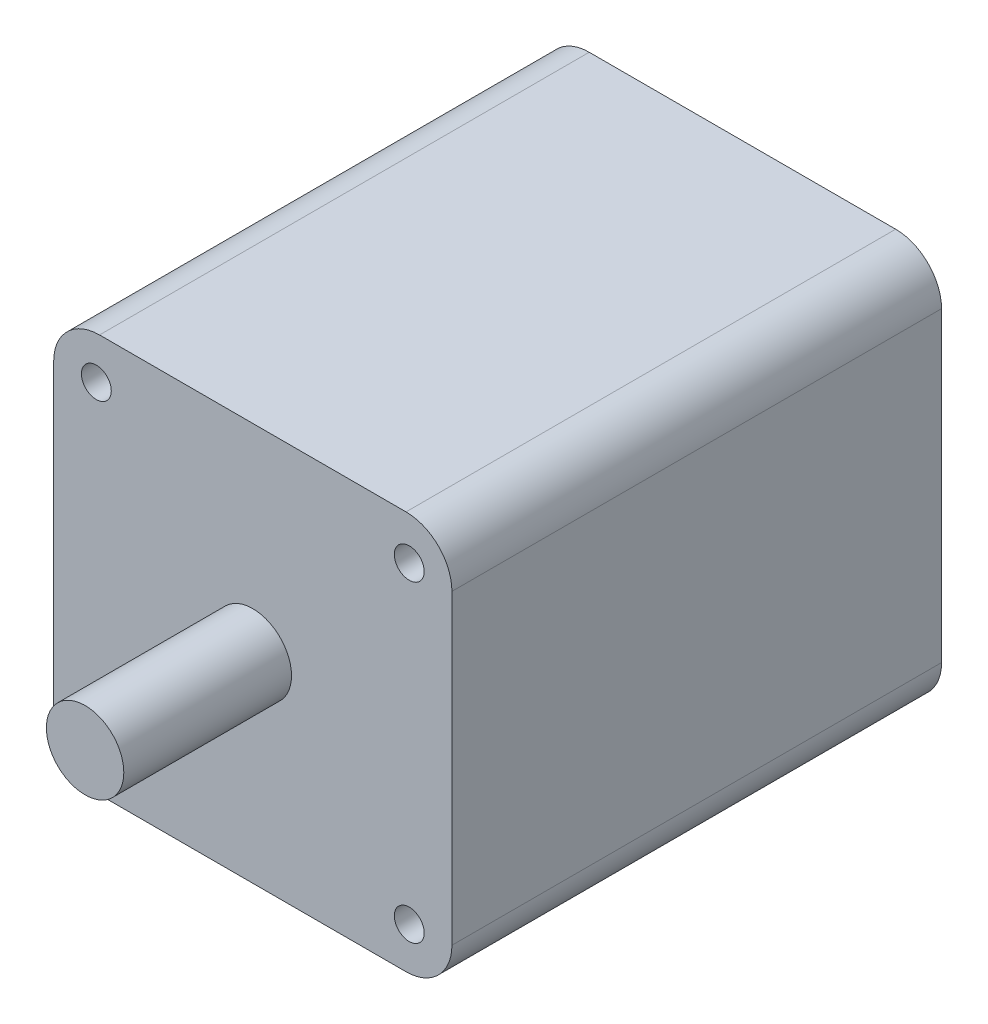
ISO-10303-21;
HEADER;
FILE_DESCRIPTION(('STEP AP214'),'2;1');
FILE_NAME('part.step','',(''),(''),'','','');
FILE_SCHEMA(('AUTOMOTIVE_DESIGN { 1 0 10303 214 1 1 1 1 }'));
ENDSEC;
DATA;
#1=APPLICATION_CONTEXT('core data for automotive mechanical design processes');
#2=APPLICATION_PROTOCOL_DEFINITION('international standard','automotive_design',2000,#1);
#3=PRODUCT_CONTEXT('',#1,'mechanical');
#4=PRODUCT('Part','Part','',(#3));
#5=PRODUCT_RELATED_PRODUCT_CATEGORY('part','',(#4));
#6=PRODUCT_DEFINITION_FORMATION('','',#4);
#7=PRODUCT_DEFINITION_CONTEXT('part definition',#1,'design');
#8=PRODUCT_DEFINITION('design','',#6,#7);
#9=PRODUCT_DEFINITION_SHAPE('','',#8);
#10=(LENGTH_UNIT() NAMED_UNIT(*) SI_UNIT(.MILLI.,.METRE.));
#11=(NAMED_UNIT(*) PLANE_ANGLE_UNIT() SI_UNIT($,.RADIAN.));
#12=(NAMED_UNIT(*) SI_UNIT($,.STERADIAN.) SOLID_ANGLE_UNIT());
#13=UNCERTAINTY_MEASURE_WITH_UNIT(LENGTH_MEASURE(1.E-05),#10,'distance_accuracy_value','');
#14=(GEOMETRIC_REPRESENTATION_CONTEXT(3) GLOBAL_UNCERTAINTY_ASSIGNED_CONTEXT((#13)) GLOBAL_UNIT_ASSIGNED_CONTEXT((#10,
#11,#12)) REPRESENTATION_CONTEXT('',''));
#15=CARTESIAN_POINT('',(0.,0.,0.));
#16=DIRECTION('',(0.,0.,1.));
#17=DIRECTION('',(1.,0.,0.));
#18=AXIS2_PLACEMENT_3D('',#15,#16,#17);
#19=CARTESIAN_POINT('',(-54.2545607414732,-46.2859797990675,221.3));
#20=DIRECTION('',(0.,0.,-1.));
#21=DIRECTION('',(-1.,0.,0.));
#22=AXIS2_PLACEMENT_3D('',#19,#20,#21);
#23=CYLINDRICAL_SURFACE('',#22,20.7410472279595);
#24=CARTESIAN_POINT('',(-54.2545607414732,-46.2859797990675,0.));
#25=DIRECTION('',(0.,0.,1.));
#26=DIRECTION('',(1.,0.,0.));
#27=AXIS2_PLACEMENT_3D('',#24,#25,#26);
#28=CIRCLE('',#27,20.7410472279595);
#29=CARTESIAN_POINT('',(-54.2545607414732,-67.027027027027,0.));
#30=VERTEX_POINT('',#29);
#31=CARTESIAN_POINT('',(-33.5135135135136,-46.2859797990675,0.));
#32=VERTEX_POINT('',#31);
#33=EDGE_CURVE('E137',#30,#32,#28,.T.);
#34=ORIENTED_EDGE('',*,*,#33,.T.);
#35=DIRECTION('',(0.,0.,-1.));
#36=VECTOR('',#35,1.);
#37=CARTESIAN_POINT('',(-33.5135135135136,-46.2859797990675,221.3));
#38=LINE('',#37,#36);
#39=CARTESIAN_POINT('',(-33.5135135135136,-46.2859797990675,221.3));
#40=VERTEX_POINT('',#39);
#41=EDGE_CURVE('E11',#40,#32,#38,.T.);
#42=ORIENTED_EDGE('',*,*,#41,.F.);
#43=CARTESIAN_POINT('',(-54.2545607414732,-46.2859797990675,221.3));
#44=DIRECTION('',(0.,0.,1.));
#45=DIRECTION('',(1.,0.,0.));
#46=AXIS2_PLACEMENT_3D('',#43,#44,#45);
#47=CIRCLE('',#46,20.7410472279595);
#48=CARTESIAN_POINT('',(-54.2545607414732,-67.027027027027,221.3));
#49=VERTEX_POINT('',#48);
#50=EDGE_CURVE('E152',#49,#40,#47,.T.);
#51=ORIENTED_EDGE('',*,*,#50,.F.);
#52=DIRECTION('',(0.,0.,-1.));
#53=VECTOR('',#52,1.);
#54=CARTESIAN_POINT('',(-54.2545607414732,-67.027027027027,221.3));
#55=LINE('',#54,#53);
#56=EDGE_CURVE('E133',#49,#30,#55,.T.);
#57=ORIENTED_EDGE('',*,*,#56,.T.);
#58=EDGE_LOOP('',(#34,#42,#51,#57));
#59=FACE_BOUND('',#58,.T.);
#60=ADVANCED_FACE('F41',(#59),#23,.T.);
#61=CARTESIAN_POINT('',(-33.5135135135136,92.2319257450135,221.3));
#62=DIRECTION('',(-1.,0.,0.));
#63=DIRECTION('',(0.,0.,1.));
#64=AXIS2_PLACEMENT_3D('',#61,#62,#63);
#65=PLANE('',#64);
#66=DIRECTION('',(0.,1.,0.));
#67=VECTOR('',#66,1.);
#68=CARTESIAN_POINT('',(-33.5135135135136,92.2319257450135,0.));
#69=LINE('',#68,#67);
#70=CARTESIAN_POINT('',(-33.5135135135136,92.2319257450135,0.));
#71=VERTEX_POINT('',#70);
#72=EDGE_CURVE('E140',#32,#71,#69,.T.);
#73=ORIENTED_EDGE('',*,*,#72,.T.);
#74=DIRECTION('',(0.,0.,-1.));
#75=VECTOR('',#74,1.);
#76=CARTESIAN_POINT('',(-33.5135135135136,92.2319257450135,221.3));
#77=LINE('',#76,#75);
#78=CARTESIAN_POINT('',(-33.5135135135136,92.2319257450135,221.3));
#79=VERTEX_POINT('',#78);
#80=EDGE_CURVE('E49',#79,#71,#77,.T.);
#81=ORIENTED_EDGE('',*,*,#80,.F.);
#82=DIRECTION('',(0.,1.,0.));
#83=VECTOR('',#82,1.);
#84=CARTESIAN_POINT('',(-33.5135135135136,92.2319257450135,221.3));
#85=LINE('',#84,#83);
#86=EDGE_CURVE('E100',#40,#79,#85,.T.);
#87=ORIENTED_EDGE('',*,*,#86,.F.);
#88=ORIENTED_EDGE('',*,*,#41,.T.);
#89=EDGE_LOOP('',(#73,#81,#87,#88));
#90=FACE_BOUND('',#89,.T.);
#91=ADVANCED_FACE('F241',(#90),#65,.F.);
#92=CARTESIAN_POINT('',(-54.2545607414731,92.2319257450135,221.3));
#93=DIRECTION('',(0.,0.,-1.));
#94=DIRECTION('',(-1.,0.,0.));
#95=AXIS2_PLACEMENT_3D('',#92,#93,#94);
#96=CYLINDRICAL_SURFACE('',#95,20.7410472279595);
#97=CARTESIAN_POINT('',(-54.2545607414731,92.2319257450135,0.));
#98=DIRECTION('',(0.,0.,1.));
#99=DIRECTION('',(-1.,0.,0.));
#100=AXIS2_PLACEMENT_3D('',#97,#98,#99);
#101=CIRCLE('',#100,20.7410472279595);
#102=CARTESIAN_POINT('',(-54.2545607414731,112.972972972973,0.));
#103=VERTEX_POINT('',#102);
#104=EDGE_CURVE('E143',#71,#103,#101,.T.);
#105=ORIENTED_EDGE('',*,*,#104,.T.);
#106=DIRECTION('',(0.,0.,-1.));
#107=VECTOR('',#106,1.);
#108=CARTESIAN_POINT('',(-54.2545607414731,112.972972972973,221.3));
#109=LINE('',#108,#107);
#110=CARTESIAN_POINT('',(-54.2545607414731,112.972972972973,221.3));
#111=VERTEX_POINT('',#110);
#112=EDGE_CURVE('E159',#111,#103,#109,.T.);
#113=ORIENTED_EDGE('',*,*,#112,.F.);
#114=CARTESIAN_POINT('',(-54.2545607414731,92.2319257450135,221.3));
#115=DIRECTION('',(0.,0.,1.));
#116=DIRECTION('',(-1.,0.,0.));
#117=AXIS2_PLACEMENT_3D('',#114,#115,#116);
#118=CIRCLE('',#117,20.7410472279595);
#119=EDGE_CURVE('E167',#79,#111,#118,.T.);
#120=ORIENTED_EDGE('',*,*,#119,.F.);
#121=ORIENTED_EDGE('',*,*,#80,.T.);
#122=EDGE_LOOP('',(#105,#113,#120,#121));
#123=FACE_BOUND('',#122,.T.);
#124=ADVANCED_FACE('F165',(#123),#96,.T.);
#125=CARTESIAN_POINT('',(-192.772466285554,112.972972972973,221.3));
#126=DIRECTION('',(0.,-1.,0.));
#127=DIRECTION('',(1.,0.,0.));
#128=AXIS2_PLACEMENT_3D('',#125,#126,#127);
#129=PLANE('',#128);
#130=DIRECTION('',(-1.,0.,0.));
#131=VECTOR('',#130,1.);
#132=CARTESIAN_POINT('',(-192.772466285554,112.972972972973,0.));
#133=LINE('',#132,#131);
#134=CARTESIAN_POINT('',(-192.772466285554,112.972972972973,0.));
#135=VERTEX_POINT('',#134);
#136=EDGE_CURVE('E145',#103,#135,#133,.T.);
#137=ORIENTED_EDGE('',*,*,#136,.T.);
#138=DIRECTION('',(0.,0.,-1.));
#139=VECTOR('',#138,1.);
#140=CARTESIAN_POINT('',(-192.772466285554,112.972972972973,221.3));
#141=LINE('',#140,#139);
#142=CARTESIAN_POINT('',(-192.772466285554,112.972972972973,221.3));
#143=VERTEX_POINT('',#142);
#144=EDGE_CURVE('E156',#143,#135,#141,.T.);
#145=ORIENTED_EDGE('',*,*,#144,.F.);
#146=DIRECTION('',(-1.,0.,0.));
#147=VECTOR('',#146,1.);
#148=CARTESIAN_POINT('',(-192.772466285554,112.972972972973,221.3));
#149=LINE('',#148,#147);
#150=EDGE_CURVE('E179',#111,#143,#149,.T.);
#151=ORIENTED_EDGE('',*,*,#150,.F.);
#152=ORIENTED_EDGE('',*,*,#112,.T.);
#153=EDGE_LOOP('',(#137,#145,#151,#152));
#154=FACE_BOUND('',#153,.T.);
#155=ADVANCED_FACE('F175',(#154),#129,.F.);
#156=CARTESIAN_POINT('',(-192.772466285554,92.2319257450135,221.3));
#157=DIRECTION('',(0.,0.,-1.));
#158=DIRECTION('',(-1.,0.,0.));
#159=AXIS2_PLACEMENT_3D('',#156,#157,#158);
#160=CYLINDRICAL_SURFACE('',#159,20.7410472279595);
#161=CARTESIAN_POINT('',(-192.772466285554,92.2319257450135,0.));
#162=DIRECTION('',(0.,0.,1.));
#163=DIRECTION('',(1.,0.,0.));
#164=AXIS2_PLACEMENT_3D('',#161,#162,#163);
#165=CIRCLE('',#164,20.7410472279595);
#166=CARTESIAN_POINT('',(-213.513513513513,92.2319257450135,0.));
#167=VERTEX_POINT('',#166);
#168=EDGE_CURVE('E147',#135,#167,#165,.T.);
#169=ORIENTED_EDGE('',*,*,#168,.T.);
#170=DIRECTION('',(0.,0.,-1.));
#171=VECTOR('',#170,1.);
#172=CARTESIAN_POINT('',(-213.513513513513,92.2319257450135,221.3));
#173=LINE('',#172,#171);
#174=CARTESIAN_POINT('',(-213.513513513513,92.2319257450135,221.3));
#175=VERTEX_POINT('',#174);
#176=EDGE_CURVE('E128',#175,#167,#173,.T.);
#177=ORIENTED_EDGE('',*,*,#176,.F.);
#178=CARTESIAN_POINT('',(-192.772466285554,92.2319257450135,221.3));
#179=DIRECTION('',(0.,0.,1.));
#180=DIRECTION('',(1.,0.,0.));
#181=AXIS2_PLACEMENT_3D('',#178,#179,#180);
#182=CIRCLE('',#181,20.7410472279595);
#183=EDGE_CURVE('E119',#143,#175,#182,.T.);
#184=ORIENTED_EDGE('',*,*,#183,.F.);
#185=ORIENTED_EDGE('',*,*,#144,.T.);
#186=EDGE_LOOP('',(#169,#177,#184,#185));
#187=FACE_BOUND('',#186,.T.);
#188=ADVANCED_FACE('F178',(#187),#160,.T.);
#189=CARTESIAN_POINT('',(-213.513513513514,92.2319257450135,221.3));
#190=DIRECTION('',(1.,0.,0.));
#191=DIRECTION('',(0.,0.,-1.));
#192=AXIS2_PLACEMENT_3D('',#189,#190,#191);
#193=PLANE('',#192);
#194=DIRECTION('',(0.,-1.,0.));
#195=VECTOR('',#194,1.);
#196=CARTESIAN_POINT('',(-213.513513513514,92.2319257450135,0.));
#197=LINE('',#196,#195);
#198=CARTESIAN_POINT('',(-213.513513513514,-46.2859797990675,0.));
#199=VERTEX_POINT('',#198);
#200=EDGE_CURVE('E127',#167,#199,#197,.T.);
#201=ORIENTED_EDGE('',*,*,#200,.T.);
#202=DIRECTION('',(0.,0.,-1.));
#203=VECTOR('',#202,1.);
#204=CARTESIAN_POINT('',(-213.513513513514,-46.2859797990675,221.3));
#205=LINE('',#204,#203);
#206=CARTESIAN_POINT('',(-213.513513513514,-46.2859797990675,221.3));
#207=VERTEX_POINT('',#206);
#208=EDGE_CURVE('E124',#207,#199,#205,.T.);
#209=ORIENTED_EDGE('',*,*,#208,.F.);
#210=DIRECTION('',(0.,-1.,0.));
#211=VECTOR('',#210,1.);
#212=CARTESIAN_POINT('',(-213.513513513514,92.2319257450135,221.3));
#213=LINE('',#212,#211);
#214=EDGE_CURVE('E113',#175,#207,#213,.T.);
#215=ORIENTED_EDGE('',*,*,#214,.F.);
#216=ORIENTED_EDGE('',*,*,#176,.T.);
#217=EDGE_LOOP('',(#201,#209,#215,#216));
#218=FACE_BOUND('',#217,.T.);
#219=ADVANCED_FACE('F125',(#218),#193,.F.);
#220=CARTESIAN_POINT('',(-192.772466285554,-46.2859797990675,221.3));
#221=DIRECTION('',(0.,0.,-1.));
#222=DIRECTION('',(-1.,0.,0.));
#223=AXIS2_PLACEMENT_3D('',#220,#221,#222);
#224=CYLINDRICAL_SURFACE('',#223,20.7410472279595);
#225=CARTESIAN_POINT('',(-192.772466285554,-46.2859797990675,0.));
#226=DIRECTION('',(0.,0.,1.));
#227=DIRECTION('',(-1.,0.,0.));
#228=AXIS2_PLACEMENT_3D('',#225,#226,#227);
#229=CIRCLE('',#228,20.7410472279595);
#230=CARTESIAN_POINT('',(-192.772466285554,-67.0270270270269,0.));
#231=VERTEX_POINT('',#230);
#232=EDGE_CURVE('E86',#199,#231,#229,.T.);
#233=ORIENTED_EDGE('',*,*,#232,.T.);
#234=DIRECTION('',(0.,0.,-1.));
#235=VECTOR('',#234,1.);
#236=CARTESIAN_POINT('',(-192.772466285554,-67.0270270270269,221.3));
#237=LINE('',#236,#235);
#238=CARTESIAN_POINT('',(-192.772466285554,-67.0270270270269,221.3));
#239=VERTEX_POINT('',#238);
#240=EDGE_CURVE('E129',#239,#231,#237,.T.);
#241=ORIENTED_EDGE('',*,*,#240,.F.);
#242=CARTESIAN_POINT('',(-192.772466285554,-46.2859797990675,221.3));
#243=DIRECTION('',(0.,0.,1.));
#244=DIRECTION('',(-1.,0.,0.));
#245=AXIS2_PLACEMENT_3D('',#242,#243,#244);
#246=CIRCLE('',#245,20.7410472279595);
#247=EDGE_CURVE('E117',#207,#239,#246,.T.);
#248=ORIENTED_EDGE('',*,*,#247,.F.);
#249=ORIENTED_EDGE('',*,*,#208,.T.);
#250=EDGE_LOOP('',(#233,#241,#248,#249));
#251=FACE_BOUND('',#250,.T.);
#252=ADVANCED_FACE('F131',(#251),#224,.T.);
#253=CARTESIAN_POINT('',(-192.772466285554,-67.0270270270269,221.3));
#254=DIRECTION('',(0.,1.,0.));
#255=DIRECTION('',(-1.,0.,0.));
#256=AXIS2_PLACEMENT_3D('',#253,#254,#255);
#257=PLANE('',#256);
#258=DIRECTION('',(1.,0.,0.));
#259=VECTOR('',#258,1.);
#260=CARTESIAN_POINT('',(-192.772466285554,-67.0270270270269,0.));
#261=LINE('',#260,#259);
#262=EDGE_CURVE('E92',#231,#30,#261,.T.);
#263=ORIENTED_EDGE('',*,*,#262,.T.);
#264=ORIENTED_EDGE('',*,*,#56,.F.);
#265=DIRECTION('',(1.,0.,0.));
#266=VECTOR('',#265,1.);
#267=CARTESIAN_POINT('',(-192.772466285554,-67.0270270270269,221.3));
#268=LINE('',#267,#266);
#269=EDGE_CURVE('E57',#239,#49,#268,.T.);
#270=ORIENTED_EDGE('',*,*,#269,.F.);
#271=ORIENTED_EDGE('',*,*,#240,.T.);
#272=EDGE_LOOP('',(#263,#264,#270,#271));
#273=FACE_BOUND('',#272,.T.);
#274=ADVANCED_FACE('F219',(#273),#257,.F.);
#275=CARTESIAN_POINT('',(-54.2545607414732,-46.2859797990675,221.3));
#276=DIRECTION('',(0.,0.,1.));
#277=DIRECTION('',(1.,0.,0.));
#278=AXIS2_PLACEMENT_3D('',#275,#276,#277);
#279=PLANE('',#278);
#280=CARTESIAN_POINT('',(-194.224191632165,93.6836510916236,221.3));
#281=DIRECTION('',(0.,0.,1.));
#282=DIRECTION('',(1.,0.,0.));
#283=AXIS2_PLACEMENT_3D('',#280,#281,#282);
#284=CIRCLE('',#283,6.75);
#285=CARTESIAN_POINT('',(-187.474191632165,93.6836510916236,221.3));
#286=VERTEX_POINT('',#285);
#287=EDGE_CURVE('E200',#286,#286,#284,.T.);
#288=ORIENTED_EDGE('',*,*,#287,.F.);
#289=EDGE_LOOP('',(#288));
#290=FACE_BOUND('',#289,.T.);
#291=CARTESIAN_POINT('',(-194.224191632157,-47.7377051456861,221.3));
#292=DIRECTION('',(0.,0.,1.));
#293=DIRECTION('',(1.,0.,0.));
#294=AXIS2_PLACEMENT_3D('',#291,#292,#293);
#295=CIRCLE('',#294,6.74999999999997);
#296=CARTESIAN_POINT('',(-187.474191632157,-47.7377051456861,221.3));
#297=VERTEX_POINT('',#296);
#298=EDGE_CURVE('E206',#297,#297,#295,.T.);
#299=ORIENTED_EDGE('',*,*,#298,.F.);
#300=EDGE_LOOP('',(#299));
#301=FACE_BOUND('',#300,.T.);
#302=CARTESIAN_POINT('',(-52.8028353948471,-47.7377051456771,221.3));
#303=DIRECTION('',(0.,0.,1.));
#304=DIRECTION('',(1.,0.,0.));
#305=AXIS2_PLACEMENT_3D('',#302,#303,#304);
#306=CIRCLE('',#305,6.74999999999999);
#307=CARTESIAN_POINT('',(-46.0528353948471,-47.7377051456771,221.3));
#308=VERTEX_POINT('',#307);
#309=EDGE_CURVE('E194',#308,#308,#306,.T.);
#310=ORIENTED_EDGE('',*,*,#309,.F.);
#311=EDGE_LOOP('',(#310));
#312=FACE_BOUND('',#311,.T.);
#313=CARTESIAN_POINT('',(-52.8028353948566,93.6836510916326,221.3));
#314=DIRECTION('',(0.,0.,1.));
#315=DIRECTION('',(1.,0.,0.));
#316=AXIS2_PLACEMENT_3D('',#313,#314,#315);
#317=CIRCLE('',#316,6.74999999999999);
#318=CARTESIAN_POINT('',(-46.0528353948566,93.6836510916326,221.3));
#319=VERTEX_POINT('',#318);
#320=EDGE_CURVE('E191',#319,#319,#317,.T.);
#321=ORIENTED_EDGE('',*,*,#320,.F.);
#322=EDGE_LOOP('',(#321));
#323=FACE_BOUND('',#322,.T.);
#324=CARTESIAN_POINT('',(-123.513513513514,22.972972972973,221.3));
#325=DIRECTION('',(0.,0.,1.));
#326=DIRECTION('',(1.,0.,0.));
#327=AXIS2_PLACEMENT_3D('',#324,#325,#326);
#328=CIRCLE('',#327,17.5);
#329=CARTESIAN_POINT('',(-106.013513513514,22.972972972973,221.3));
#330=VERTEX_POINT('',#329);
#331=EDGE_CURVE('E185',#330,#330,#328,.T.);
#332=ORIENTED_EDGE('',*,*,#331,.F.);
#333=EDGE_LOOP('',(#332));
#334=FACE_BOUND('',#333,.T.);
#335=ORIENTED_EDGE('',*,*,#50,.T.);
#336=ORIENTED_EDGE('',*,*,#86,.T.);
#337=ORIENTED_EDGE('',*,*,#119,.T.);
#338=ORIENTED_EDGE('',*,*,#150,.T.);
#339=ORIENTED_EDGE('',*,*,#183,.T.);
#340=ORIENTED_EDGE('',*,*,#214,.T.);
#341=ORIENTED_EDGE('',*,*,#247,.T.);
#342=ORIENTED_EDGE('',*,*,#269,.T.);
#343=EDGE_LOOP('',(#335,#336,#337,#338,#339,#340,#341,#342));
#344=FACE_BOUND('',#343,.T.);
#345=ADVANCED_FACE('F115',(#290,#301,#312,#323,#334,#344),#279,.T.);
#346=CARTESIAN_POINT('',(-54.2545607414732,-46.2859797990675,0.));
#347=DIRECTION('',(0.,0.,1.));
#348=DIRECTION('',(1.,0.,0.));
#349=AXIS2_PLACEMENT_3D('',#346,#347,#348);
#350=PLANE('',#349);
#351=ORIENTED_EDGE('',*,*,#33,.F.);
#352=ORIENTED_EDGE('',*,*,#262,.F.);
#353=ORIENTED_EDGE('',*,*,#232,.F.);
#354=ORIENTED_EDGE('',*,*,#200,.F.);
#355=ORIENTED_EDGE('',*,*,#168,.F.);
#356=ORIENTED_EDGE('',*,*,#136,.F.);
#357=ORIENTED_EDGE('',*,*,#104,.F.);
#358=ORIENTED_EDGE('',*,*,#72,.F.);
#359=EDGE_LOOP('',(#351,#352,#353,#354,#355,#356,#357,#358));
#360=FACE_BOUND('',#359,.T.);
#361=ADVANCED_FACE('F171',(#360),#350,.F.);
#362=CARTESIAN_POINT('',(-123.513513513514,22.972972972973,297.1));
#363=DIRECTION('',(0.,0.,-1.));
#364=DIRECTION('',(-1.,0.,0.));
#365=AXIS2_PLACEMENT_3D('',#362,#363,#364);
#366=CYLINDRICAL_SURFACE('',#365,17.5);
#367=CARTESIAN_POINT('',(-123.513513513514,22.972972972973,297.1));
#368=DIRECTION('',(0.,0.,1.));
#369=DIRECTION('',(1.,0.,0.));
#370=AXIS2_PLACEMENT_3D('',#367,#368,#369);
#371=CIRCLE('',#370,17.5);
#372=CARTESIAN_POINT('',(-106.013513513514,22.972972972973,297.1));
#373=VERTEX_POINT('',#372);
#374=EDGE_CURVE('E141',#373,#373,#371,.T.);
#375=ORIENTED_EDGE('',*,*,#374,.F.);
#376=EDGE_LOOP('',(#375));
#377=FACE_BOUND('',#376,.T.);
#378=ORIENTED_EDGE('',*,*,#331,.T.);
#379=EDGE_LOOP('',(#378));
#380=FACE_BOUND('',#379,.T.);
#381=ADVANCED_FACE('F226',(#377,#380),#366,.T.);
#382=CARTESIAN_POINT('',(-123.513513513514,22.972972972973,297.1));
#383=DIRECTION('',(0.,0.,1.));
#384=DIRECTION('',(1.,0.,0.));
#385=AXIS2_PLACEMENT_3D('',#382,#383,#384);
#386=PLANE('',#385);
#387=ORIENTED_EDGE('',*,*,#374,.T.);
#388=EDGE_LOOP('',(#387));
#389=FACE_BOUND('',#388,.T.);
#390=ADVANCED_FACE('F228',(#389),#386,.T.);
#391=CARTESIAN_POINT('',(-52.8028353948566,93.6836510916326,206.3));
#392=DIRECTION('',(0.,0.,1.));
#393=DIRECTION('',(1.,0.,0.));
#394=AXIS2_PLACEMENT_3D('',#391,#392,#393);
#395=CYLINDRICAL_SURFACE('',#394,6.74999999999999);
#396=CARTESIAN_POINT('',(-52.8028353948566,93.6836510916326,206.3));
#397=DIRECTION('',(0.,0.,1.));
#398=DIRECTION('',(1.,0.,0.));
#399=AXIS2_PLACEMENT_3D('',#396,#397,#398);
#400=CIRCLE('',#399,6.74999999999999);
#401=CARTESIAN_POINT('',(-46.0528353948566,93.6836510916326,206.3));
#402=VERTEX_POINT('',#401);
#403=EDGE_CURVE('E188',#402,#402,#400,.T.);
#404=ORIENTED_EDGE('',*,*,#403,.F.);
#405=EDGE_LOOP('',(#404));
#406=FACE_BOUND('',#405,.T.);
#407=ORIENTED_EDGE('',*,*,#320,.T.);
#408=EDGE_LOOP('',(#407));
#409=FACE_BOUND('',#408,.T.);
#410=ADVANCED_FACE('F235',(#406,#409),#395,.F.);
#411=CARTESIAN_POINT('',(-52.8028353948566,93.6836510916326,206.3));
#412=DIRECTION('',(0.,0.,1.));
#413=DIRECTION('',(1.,0.,0.));
#414=AXIS2_PLACEMENT_3D('',#411,#412,#413);
#415=PLANE('',#414);
#416=ORIENTED_EDGE('',*,*,#403,.T.);
#417=EDGE_LOOP('',(#416));
#418=FACE_BOUND('',#417,.T.);
#419=ADVANCED_FACE('F323',(#418),#415,.T.);
#420=CARTESIAN_POINT('',(-52.8028353948471,-47.7377051456771,206.3));
#421=DIRECTION('',(0.,0.,1.));
#422=DIRECTION('',(1.,0.,0.));
#423=AXIS2_PLACEMENT_3D('',#420,#421,#422);
#424=CYLINDRICAL_SURFACE('',#423,6.74999999999999);
#425=CARTESIAN_POINT('',(-52.8028353948471,-47.7377051456771,206.3));
#426=DIRECTION('',(0.,0.,1.));
#427=DIRECTION('',(1.,0.,0.));
#428=AXIS2_PLACEMENT_3D('',#425,#426,#427);
#429=CIRCLE('',#428,6.74999999999999);
#430=CARTESIAN_POINT('',(-46.0528353948471,-47.7377051456771,206.3));
#431=VERTEX_POINT('',#430);
#432=EDGE_CURVE('E209',#431,#431,#429,.T.);
#433=ORIENTED_EDGE('',*,*,#432,.F.);
#434=EDGE_LOOP('',(#433));
#435=FACE_BOUND('',#434,.T.);
#436=ORIENTED_EDGE('',*,*,#309,.T.);
#437=EDGE_LOOP('',(#436));
#438=FACE_BOUND('',#437,.T.);
#439=ADVANCED_FACE('F215',(#435,#438),#424,.F.);
#440=CARTESIAN_POINT('',(-52.8028353948471,-47.7377051456771,206.3));
#441=DIRECTION('',(0.,0.,1.));
#442=DIRECTION('',(1.,0.,0.));
#443=AXIS2_PLACEMENT_3D('',#440,#441,#442);
#444=PLANE('',#443);
#445=ORIENTED_EDGE('',*,*,#432,.T.);
#446=EDGE_LOOP('',(#445));
#447=FACE_BOUND('',#446,.T.);
#448=ADVANCED_FACE('F344',(#447),#444,.T.);
#449=CARTESIAN_POINT('',(-194.224191632157,-47.7377051456861,206.3));
#450=DIRECTION('',(0.,0.,1.));
#451=DIRECTION('',(1.,0.,0.));
#452=AXIS2_PLACEMENT_3D('',#449,#450,#451);
#453=CYLINDRICAL_SURFACE('',#452,6.74999999999997);
#454=CARTESIAN_POINT('',(-194.224191632157,-47.7377051456861,206.3));
#455=DIRECTION('',(0.,0.,1.));
#456=DIRECTION('',(1.,0.,0.));
#457=AXIS2_PLACEMENT_3D('',#454,#455,#456);
#458=CIRCLE('',#457,6.74999999999997);
#459=CARTESIAN_POINT('',(-187.474191632157,-47.7377051456861,206.3));
#460=VERTEX_POINT('',#459);
#461=EDGE_CURVE('E203',#460,#460,#458,.T.);
#462=ORIENTED_EDGE('',*,*,#461,.F.);
#463=EDGE_LOOP('',(#462));
#464=FACE_BOUND('',#463,.T.);
#465=ORIENTED_EDGE('',*,*,#298,.T.);
#466=EDGE_LOOP('',(#465));
#467=FACE_BOUND('',#466,.T.);
#468=ADVANCED_FACE('F355',(#464,#467),#453,.F.);
#469=CARTESIAN_POINT('',(-194.224191632157,-47.7377051456861,206.3));
#470=DIRECTION('',(0.,0.,1.));
#471=DIRECTION('',(1.,0.,0.));
#472=AXIS2_PLACEMENT_3D('',#469,#470,#471);
#473=PLANE('',#472);
#474=ORIENTED_EDGE('',*,*,#461,.T.);
#475=EDGE_LOOP('',(#474));
#476=FACE_BOUND('',#475,.T.);
#477=ADVANCED_FACE('F366',(#476),#473,.T.);
#478=CARTESIAN_POINT('',(-194.224191632165,93.6836510916236,206.3));
#479=DIRECTION('',(0.,0.,1.));
#480=DIRECTION('',(1.,0.,0.));
#481=AXIS2_PLACEMENT_3D('',#478,#479,#480);
#482=CYLINDRICAL_SURFACE('',#481,6.75);
#483=CARTESIAN_POINT('',(-194.224191632165,93.6836510916236,206.3));
#484=DIRECTION('',(0.,0.,1.));
#485=DIRECTION('',(1.,0.,0.));
#486=AXIS2_PLACEMENT_3D('',#483,#484,#485);
#487=CIRCLE('',#486,6.75);
#488=CARTESIAN_POINT('',(-187.474191632165,93.6836510916236,206.3));
#489=VERTEX_POINT('',#488);
#490=EDGE_CURVE('E197',#489,#489,#487,.T.);
#491=ORIENTED_EDGE('',*,*,#490,.F.);
#492=EDGE_LOOP('',(#491));
#493=FACE_BOUND('',#492,.T.);
#494=ORIENTED_EDGE('',*,*,#287,.T.);
#495=EDGE_LOOP('',(#494));
#496=FACE_BOUND('',#495,.T.);
#497=ADVANCED_FACE('F377',(#493,#496),#482,.F.);
#498=CARTESIAN_POINT('',(-194.224191632165,93.6836510916236,206.3));
#499=DIRECTION('',(0.,0.,1.));
#500=DIRECTION('',(1.,0.,0.));
#501=AXIS2_PLACEMENT_3D('',#498,#499,#500);
#502=PLANE('',#501);
#503=ORIENTED_EDGE('',*,*,#490,.T.);
#504=EDGE_LOOP('',(#503));
#505=FACE_BOUND('',#504,.T.);
#506=ADVANCED_FACE('F388',(#505),#502,.T.);
#507=CLOSED_SHELL('',(#60,#91,#124,#155,#188,#219,#252,#274,#345,#361,#381,#390,#410,#419,#439,
#448,#468,#477,#497,#506));
#508=MANIFOLD_SOLID_BREP('B2',#507);
#509=ADVANCED_BREP_SHAPE_REPRESENTATION('',(#18,#508),#14);
#510=SHAPE_DEFINITION_REPRESENTATION(#9,#509);
ENDSEC;
END-ISO-10303-21;
